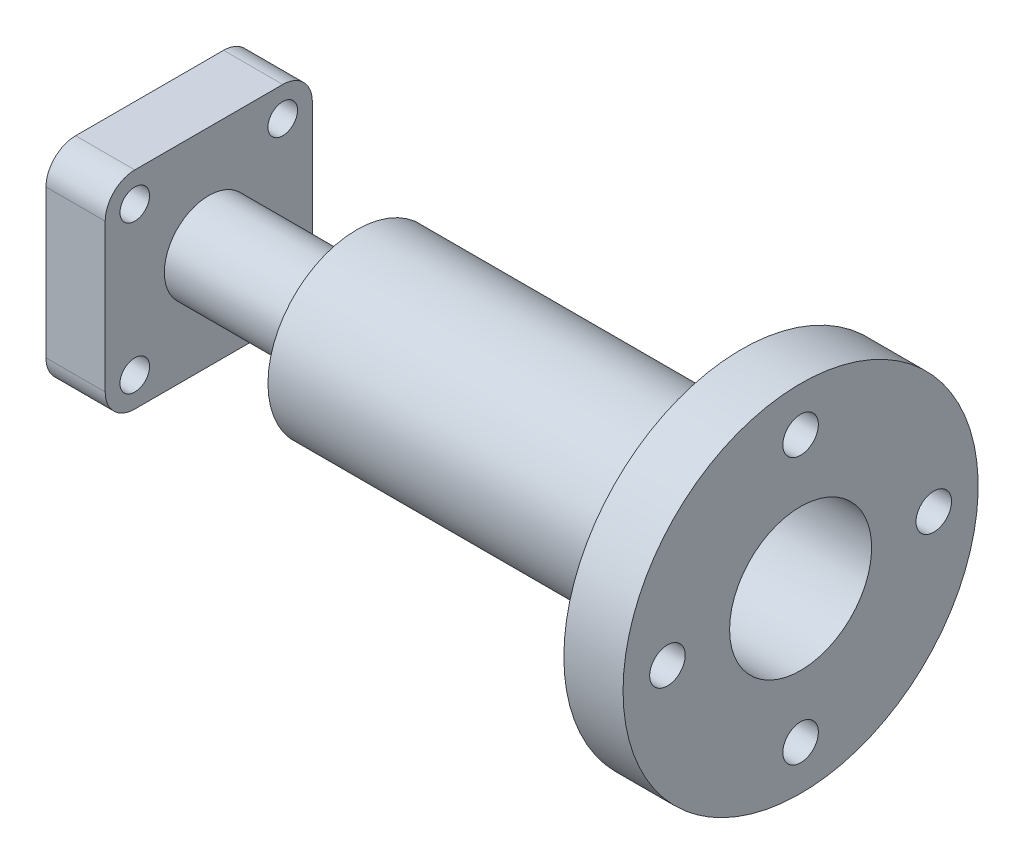
ISO-10303-21;
HEADER;
FILE_DESCRIPTION(('STEP AP214'),'2;1');
FILE_NAME('part.step','',(''),(''),'','','');
FILE_SCHEMA(('AUTOMOTIVE_DESIGN { 1 0 10303 214 1 1 1 1 }'));
ENDSEC;
DATA;
#1=APPLICATION_CONTEXT('core data for automotive mechanical design processes');
#2=APPLICATION_PROTOCOL_DEFINITION('international standard','automotive_design',2000,#1);
#3=PRODUCT_CONTEXT('',#1,'mechanical');
#4=PRODUCT('Part','Part','',(#3));
#5=PRODUCT_RELATED_PRODUCT_CATEGORY('part','',(#4));
#6=PRODUCT_DEFINITION_FORMATION('','',#4);
#7=PRODUCT_DEFINITION_CONTEXT('part definition',#1,'design');
#8=PRODUCT_DEFINITION('design','',#6,#7);
#9=PRODUCT_DEFINITION_SHAPE('','',#8);
#10=(LENGTH_UNIT() NAMED_UNIT(*) SI_UNIT(.MILLI.,.METRE.));
#11=(NAMED_UNIT(*) PLANE_ANGLE_UNIT() SI_UNIT($,.RADIAN.));
#12=(NAMED_UNIT(*) SI_UNIT($,.STERADIAN.) SOLID_ANGLE_UNIT());
#13=UNCERTAINTY_MEASURE_WITH_UNIT(LENGTH_MEASURE(1.E-05),#10,'distance_accuracy_value','');
#14=(GEOMETRIC_REPRESENTATION_CONTEXT(3) GLOBAL_UNCERTAINTY_ASSIGNED_CONTEXT((#13)) GLOBAL_UNIT_ASSIGNED_CONTEXT((#10,
#11,#12)) REPRESENTATION_CONTEXT('',''));
#15=CARTESIAN_POINT('',(0.,0.,0.));
#16=DIRECTION('',(0.,0.,1.));
#17=DIRECTION('',(1.,0.,0.));
#18=AXIS2_PLACEMENT_3D('',#15,#16,#17);
#19=CARTESIAN_POINT('',(180.,60.,0.));
#20=DIRECTION('',(1.,0.,0.));
#21=DIRECTION('',(0.,0.,-1.));
#22=AXIS2_PLACEMENT_3D('',#19,#20,#21);
#23=PLANE('',#22);
#24=CARTESIAN_POINT('',(180.,45.,0.));
#25=DIRECTION('',(1.,0.,0.));
#26=DIRECTION('',(0.,0.,-1.));
#27=AXIS2_PLACEMENT_3D('',#24,#25,#26);
#28=CIRCLE('',#27,5.99999999999999);
#29=CARTESIAN_POINT('',(180.,45.,-5.99999999999999));
#30=VERTEX_POINT('',#29);
#31=EDGE_CURVE('E252',#30,#30,#28,.F.);
#32=ORIENTED_EDGE('',*,*,#31,.F.);
#33=EDGE_LOOP('',(#32));
#34=FACE_BOUND('',#33,.T.);
#35=CARTESIAN_POINT('',(180.,0.,0.));
#36=DIRECTION('',(-1.,0.,0.));
#37=DIRECTION('',(0.,0.,1.));
#38=AXIS2_PLACEMENT_3D('',#35,#36,#37);
#39=CIRCLE('',#38,30.);
#40=CARTESIAN_POINT('',(180.,0.,30.));
#41=VERTEX_POINT('',#40);
#42=EDGE_CURVE('E167',#41,#41,#39,.T.);
#43=ORIENTED_EDGE('',*,*,#42,.F.);
#44=EDGE_LOOP('',(#43));
#45=FACE_BOUND('',#44,.T.);
#46=CARTESIAN_POINT('',(180.,0.,0.));
#47=DIRECTION('',(-1.,0.,0.));
#48=DIRECTION('',(0.,0.,1.));
#49=AXIS2_PLACEMENT_3D('',#46,#47,#48);
#50=CIRCLE('',#49,60.);
#51=CARTESIAN_POINT('',(180.,0.,60.));
#52=VERTEX_POINT('',#51);
#53=EDGE_CURVE('E170',#52,#52,#50,.T.);
#54=ORIENTED_EDGE('',*,*,#53,.T.);
#55=EDGE_LOOP('',(#54));
#56=FACE_BOUND('',#55,.T.);
#57=CARTESIAN_POINT('',(180.,0.,-45.));
#58=DIRECTION('',(1.,0.,0.));
#59=DIRECTION('',(0.,0.,-1.));
#60=AXIS2_PLACEMENT_3D('',#57,#58,#59);
#61=CIRCLE('',#60,5.99999999999999);
#62=CARTESIAN_POINT('',(180.,0.,-51.));
#63=VERTEX_POINT('',#62);
#64=EDGE_CURVE('E236',#63,#63,#61,.F.);
#65=ORIENTED_EDGE('',*,*,#64,.F.);
#66=EDGE_LOOP('',(#65));
#67=FACE_BOUND('',#66,.T.);
#68=CARTESIAN_POINT('',(180.,-45.,0.));
#69=DIRECTION('',(1.,0.,0.));
#70=DIRECTION('',(0.,0.,-1.));
#71=AXIS2_PLACEMENT_3D('',#68,#69,#70);
#72=CIRCLE('',#71,5.99999999999999);
#73=CARTESIAN_POINT('',(180.,-45.,-5.99999999999999));
#74=VERTEX_POINT('',#73);
#75=EDGE_CURVE('E240',#74,#74,#72,.F.);
#76=ORIENTED_EDGE('',*,*,#75,.F.);
#77=EDGE_LOOP('',(#76));
#78=FACE_BOUND('',#77,.T.);
#79=CARTESIAN_POINT('',(180.,0.,45.));
#80=DIRECTION('',(1.,0.,0.));
#81=DIRECTION('',(0.,0.,-1.));
#82=AXIS2_PLACEMENT_3D('',#79,#80,#81);
#83=CIRCLE('',#82,5.99999999999999);
#84=CARTESIAN_POINT('',(180.,0.,39.));
#85=VERTEX_POINT('',#84);
#86=EDGE_CURVE('E246',#85,#85,#83,.F.);
#87=ORIENTED_EDGE('',*,*,#86,.F.);
#88=EDGE_LOOP('',(#87));
#89=FACE_BOUND('',#88,.T.);
#90=ADVANCED_FACE('F44',(#34,#45,#56,#67,#78,#89),#23,.F.);
#91=CARTESIAN_POINT('',(0.,0.,0.));
#92=DIRECTION('',(-1.,0.,0.));
#93=DIRECTION('',(0.,0.,1.));
#94=AXIS2_PLACEMENT_3D('',#91,#92,#93);
#95=CYLINDRICAL_SURFACE('',#94,60.);
#96=ORIENTED_EDGE('',*,*,#53,.F.);
#97=EDGE_LOOP('',(#96));
#98=FACE_BOUND('',#97,.T.);
#99=CARTESIAN_POINT('',(200.,0.,0.));
#100=DIRECTION('',(-1.,0.,0.));
#101=DIRECTION('',(0.,0.,1.));
#102=AXIS2_PLACEMENT_3D('',#99,#100,#101);
#103=CIRCLE('',#102,60.);
#104=CARTESIAN_POINT('',(200.,0.,60.));
#105=VERTEX_POINT('',#104);
#106=EDGE_CURVE('E146',#105,#105,#103,.T.);
#107=ORIENTED_EDGE('',*,*,#106,.T.);
#108=EDGE_LOOP('',(#107));
#109=FACE_BOUND('',#108,.T.);
#110=ADVANCED_FACE('F266',(#98,#109),#95,.T.);
#111=CARTESIAN_POINT('',(0.,0.,0.));
#112=DIRECTION('',(-1.,0.,0.));
#113=DIRECTION('',(0.,0.,1.));
#114=AXIS2_PLACEMENT_3D('',#111,#112,#113);
#115=CYLINDRICAL_SURFACE('',#114,30.);
#116=CARTESIAN_POINT('',(50.,0.,0.));
#117=DIRECTION('',(-1.,0.,0.));
#118=DIRECTION('',(0.,0.,1.));
#119=AXIS2_PLACEMENT_3D('',#116,#117,#118);
#120=CIRCLE('',#119,30.);
#121=CARTESIAN_POINT('',(50.,0.,30.));
#122=VERTEX_POINT('',#121);
#123=EDGE_CURVE('E164',#122,#122,#120,.T.);
#124=ORIENTED_EDGE('',*,*,#123,.F.);
#125=EDGE_LOOP('',(#124));
#126=FACE_BOUND('',#125,.T.);
#127=ORIENTED_EDGE('',*,*,#42,.T.);
#128=EDGE_LOOP('',(#127));
#129=FACE_BOUND('',#128,.T.);
#130=ADVANCED_FACE('F347',(#126,#129),#115,.T.);
#131=CARTESIAN_POINT('',(50.,30.,0.));
#132=DIRECTION('',(1.,0.,0.));
#133=DIRECTION('',(0.,0.,-1.));
#134=AXIS2_PLACEMENT_3D('',#131,#132,#133);
#135=PLANE('',#134);
#136=CARTESIAN_POINT('',(50.,0.,0.));
#137=DIRECTION('',(-1.,0.,0.));
#138=DIRECTION('',(0.,0.,1.));
#139=AXIS2_PLACEMENT_3D('',#136,#137,#138);
#140=CIRCLE('',#139,15.);
#141=CARTESIAN_POINT('',(50.,0.,15.));
#142=VERTEX_POINT('',#141);
#143=EDGE_CURVE('E161',#142,#142,#140,.T.);
#144=ORIENTED_EDGE('',*,*,#143,.F.);
#145=EDGE_LOOP('',(#144));
#146=FACE_BOUND('',#145,.T.);
#147=ORIENTED_EDGE('',*,*,#123,.T.);
#148=EDGE_LOOP('',(#147));
#149=FACE_BOUND('',#148,.T.);
#150=ADVANCED_FACE('F343',(#146,#149),#135,.F.);
#151=CARTESIAN_POINT('',(0.,0.,0.));
#152=DIRECTION('',(-1.,0.,0.));
#153=DIRECTION('',(0.,0.,1.));
#154=AXIS2_PLACEMENT_3D('',#151,#152,#153);
#155=CYLINDRICAL_SURFACE('',#154,15.);
#156=CARTESIAN_POINT('',(0.,0.,0.));
#157=DIRECTION('',(-1.,0.,0.));
#158=DIRECTION('',(0.,0.,1.));
#159=AXIS2_PLACEMENT_3D('',#156,#157,#158);
#160=CIRCLE('',#159,15.);
#161=CARTESIAN_POINT('',(0.,0.,15.));
#162=VERTEX_POINT('',#161);
#163=EDGE_CURVE('E158',#162,#162,#160,.T.);
#164=ORIENTED_EDGE('',*,*,#163,.F.);
#165=EDGE_LOOP('',(#164));
#166=FACE_BOUND('',#165,.T.);
#167=ORIENTED_EDGE('',*,*,#143,.T.);
#168=EDGE_LOOP('',(#167));
#169=FACE_BOUND('',#168,.T.);
#170=ADVANCED_FACE('F314',(#166,#169),#155,.T.);
#171=CARTESIAN_POINT('',(0.,0.,0.));
#172=DIRECTION('',(-1.,0.,0.));
#173=DIRECTION('',(0.,0.,1.));
#174=AXIS2_PLACEMENT_3D('',#171,#172,#173);
#175=CYLINDRICAL_SURFACE('',#174,9.);
#176=CARTESIAN_POINT('',(56.,0.,0.));
#177=DIRECTION('',(-1.,0.,0.));
#178=DIRECTION('',(0.,0.,1.));
#179=AXIS2_PLACEMENT_3D('',#176,#177,#178);
#180=CIRCLE('',#179,9.);
#181=CARTESIAN_POINT('',(56.,0.,9.));
#182=VERTEX_POINT('',#181);
#183=EDGE_CURVE('E155',#182,#182,#180,.T.);
#184=ORIENTED_EDGE('',*,*,#183,.F.);
#185=EDGE_LOOP('',(#184));
#186=FACE_BOUND('',#185,.T.);
#187=CARTESIAN_POINT('',(-20.,0.,0.));
#188=DIRECTION('',(-1.,0.,0.));
#189=DIRECTION('',(0.,0.,1.));
#190=AXIS2_PLACEMENT_3D('',#187,#188,#189);
#191=CIRCLE('',#190,8.99999999999999);
#192=CARTESIAN_POINT('',(-20.,0.,8.99999999999999));
#193=VERTEX_POINT('',#192);
#194=EDGE_CURVE('E231',#193,#193,#191,.T.);
#195=ORIENTED_EDGE('',*,*,#194,.T.);
#196=EDGE_LOOP('',(#195));
#197=FACE_BOUND('',#196,.T.);
#198=ADVANCED_FACE('F308',(#186,#197),#175,.F.);
#199=CARTESIAN_POINT('',(56.,24.,0.));
#200=DIRECTION('',(-1.,0.,0.));
#201=DIRECTION('',(0.,0.,1.));
#202=AXIS2_PLACEMENT_3D('',#199,#200,#201);
#203=PLANE('',#202);
#204=CARTESIAN_POINT('',(56.,0.,0.));
#205=DIRECTION('',(-1.,0.,0.));
#206=DIRECTION('',(0.,0.,1.));
#207=AXIS2_PLACEMENT_3D('',#204,#205,#206);
#208=CIRCLE('',#207,24.);
#209=CARTESIAN_POINT('',(56.,0.,24.));
#210=VERTEX_POINT('',#209);
#211=EDGE_CURVE('E152',#210,#210,#208,.T.);
#212=ORIENTED_EDGE('',*,*,#211,.F.);
#213=EDGE_LOOP('',(#212));
#214=FACE_BOUND('',#213,.T.);
#215=ORIENTED_EDGE('',*,*,#183,.T.);
#216=EDGE_LOOP('',(#215));
#217=FACE_BOUND('',#216,.T.);
#218=ADVANCED_FACE('F302',(#214,#217),#203,.F.);
#219=CARTESIAN_POINT('',(0.,0.,0.));
#220=DIRECTION('',(-1.,0.,0.));
#221=DIRECTION('',(0.,0.,1.));
#222=AXIS2_PLACEMENT_3D('',#219,#220,#221);
#223=CYLINDRICAL_SURFACE('',#222,24.);
#224=CARTESIAN_POINT('',(200.,0.,0.));
#225=DIRECTION('',(-1.,0.,0.));
#226=DIRECTION('',(0.,0.,1.));
#227=AXIS2_PLACEMENT_3D('',#224,#225,#226);
#228=CIRCLE('',#227,24.);
#229=CARTESIAN_POINT('',(200.,0.,24.));
#230=VERTEX_POINT('',#229);
#231=EDGE_CURVE('E149',#230,#230,#228,.T.);
#232=ORIENTED_EDGE('',*,*,#231,.F.);
#233=EDGE_LOOP('',(#232));
#234=FACE_BOUND('',#233,.T.);
#235=ORIENTED_EDGE('',*,*,#211,.T.);
#236=EDGE_LOOP('',(#235));
#237=FACE_BOUND('',#236,.T.);
#238=ADVANCED_FACE('F289',(#234,#237),#223,.F.);
#239=CARTESIAN_POINT('',(200.,24.,0.));
#240=DIRECTION('',(-1.,0.,0.));
#241=DIRECTION('',(0.,0.,1.));
#242=AXIS2_PLACEMENT_3D('',#239,#240,#241);
#243=PLANE('',#242);
#244=CARTESIAN_POINT('',(200.,45.,0.));
#245=DIRECTION('',(1.,0.,0.));
#246=DIRECTION('',(0.,0.,-1.));
#247=AXIS2_PLACEMENT_3D('',#244,#245,#246);
#248=CIRCLE('',#247,5.99999999999998);
#249=CARTESIAN_POINT('',(200.,45.,-5.99999999999998));
#250=VERTEX_POINT('',#249);
#251=EDGE_CURVE('E255',#250,#250,#248,.T.);
#252=ORIENTED_EDGE('',*,*,#251,.F.);
#253=EDGE_LOOP('',(#252));
#254=FACE_BOUND('',#253,.T.);
#255=CARTESIAN_POINT('',(200.,0.,45.));
#256=DIRECTION('',(1.,0.,0.));
#257=DIRECTION('',(0.,0.,-1.));
#258=AXIS2_PLACEMENT_3D('',#255,#256,#257);
#259=CIRCLE('',#258,5.99999999999999);
#260=CARTESIAN_POINT('',(200.,0.,39.));
#261=VERTEX_POINT('',#260);
#262=EDGE_CURVE('E249',#261,#261,#259,.T.);
#263=ORIENTED_EDGE('',*,*,#262,.F.);
#264=EDGE_LOOP('',(#263));
#265=FACE_BOUND('',#264,.T.);
#266=CARTESIAN_POINT('',(200.,-45.,0.));
#267=DIRECTION('',(1.,0.,0.));
#268=DIRECTION('',(0.,0.,-1.));
#269=AXIS2_PLACEMENT_3D('',#266,#267,#268);
#270=CIRCLE('',#269,5.99999999999998);
#271=CARTESIAN_POINT('',(200.,-45.,-5.99999999999998));
#272=VERTEX_POINT('',#271);
#273=EDGE_CURVE('E243',#272,#272,#270,.T.);
#274=ORIENTED_EDGE('',*,*,#273,.F.);
#275=EDGE_LOOP('',(#274));
#276=FACE_BOUND('',#275,.T.);
#277=CARTESIAN_POINT('',(200.,0.,-45.));
#278=DIRECTION('',(1.,0.,0.));
#279=DIRECTION('',(0.,0.,-1.));
#280=AXIS2_PLACEMENT_3D('',#277,#278,#279);
#281=CIRCLE('',#280,5.99999999999999);
#282=CARTESIAN_POINT('',(200.,0.,-51.));
#283=VERTEX_POINT('',#282);
#284=EDGE_CURVE('E237',#283,#283,#281,.T.);
#285=ORIENTED_EDGE('',*,*,#284,.F.);
#286=EDGE_LOOP('',(#285));
#287=FACE_BOUND('',#286,.T.);
#288=ORIENTED_EDGE('',*,*,#106,.F.);
#289=EDGE_LOOP('',(#288));
#290=FACE_BOUND('',#289,.T.);
#291=ORIENTED_EDGE('',*,*,#231,.T.);
#292=EDGE_LOOP('',(#291));
#293=FACE_BOUND('',#292,.T.);
#294=ADVANCED_FACE('F285',(#254,#265,#276,#287,#290,#293),#243,.F.);
#295=CARTESIAN_POINT('',(-20.,0.,0.));
#296=DIRECTION('',(1.,0.,0.));
#297=DIRECTION('',(0.,0.,-1.));
#298=AXIS2_PLACEMENT_3D('',#295,#296,#297);
#299=PLANE('',#298);
#300=DIRECTION('',(0.,-1.,0.));
#301=VECTOR('',#300,1.);
#302=CARTESIAN_POINT('',(-20.,-35.,-35.));
#303=LINE('',#302,#301);
#304=CARTESIAN_POINT('',(-20.,25.,-35.));
#305=VERTEX_POINT('',#304);
#306=CARTESIAN_POINT('',(-20.,-25.,-35.));
#307=VERTEX_POINT('',#306);
#308=EDGE_CURVE('E209',#305,#307,#303,.T.);
#309=ORIENTED_EDGE('',*,*,#308,.T.);
#310=CARTESIAN_POINT('',(-20.,-25.,-25.));
#311=DIRECTION('',(1.,0.,0.));
#312=DIRECTION('',(0.,0.,-1.));
#313=AXIS2_PLACEMENT_3D('',#310,#311,#312);
#314=CIRCLE('',#313,10.);
#315=CARTESIAN_POINT('',(-20.,-35.,-25.));
#316=VERTEX_POINT('',#315);
#317=EDGE_CURVE('E186',#307,#316,#314,.F.);
#318=ORIENTED_EDGE('',*,*,#317,.T.);
#319=DIRECTION('',(0.,0.,1.));
#320=VECTOR('',#319,1.);
#321=CARTESIAN_POINT('',(-20.,-35.,-35.));
#322=LINE('',#321,#320);
#323=CARTESIAN_POINT('',(-20.,-35.,25.));
#324=VERTEX_POINT('',#323);
#325=EDGE_CURVE('E130',#316,#324,#322,.T.);
#326=ORIENTED_EDGE('',*,*,#325,.T.);
#327=CARTESIAN_POINT('',(-20.,-25.,25.));
#328=DIRECTION('',(1.,0.,0.));
#329=DIRECTION('',(0.,0.,-1.));
#330=AXIS2_PLACEMENT_3D('',#327,#328,#329);
#331=CIRCLE('',#330,10.);
#332=CARTESIAN_POINT('',(-20.,-25.,35.));
#333=VERTEX_POINT('',#332);
#334=EDGE_CURVE('E184',#324,#333,#331,.F.);
#335=ORIENTED_EDGE('',*,*,#334,.T.);
#336=DIRECTION('',(0.,1.,0.));
#337=VECTOR('',#336,1.);
#338=CARTESIAN_POINT('',(-20.,-35.,35.));
#339=LINE('',#338,#337);
#340=CARTESIAN_POINT('',(-20.,25.,35.));
#341=VERTEX_POINT('',#340);
#342=EDGE_CURVE('E137',#333,#341,#339,.T.);
#343=ORIENTED_EDGE('',*,*,#342,.T.);
#344=CARTESIAN_POINT('',(-20.,25.,25.));
#345=DIRECTION('',(1.,0.,0.));
#346=DIRECTION('',(0.,0.,-1.));
#347=AXIS2_PLACEMENT_3D('',#344,#345,#346);
#348=CIRCLE('',#347,10.);
#349=CARTESIAN_POINT('',(-20.,35.,25.));
#350=VERTEX_POINT('',#349);
#351=EDGE_CURVE('E65',#341,#350,#348,.F.);
#352=ORIENTED_EDGE('',*,*,#351,.T.);
#353=DIRECTION('',(0.,0.,-1.));
#354=VECTOR('',#353,1.);
#355=CARTESIAN_POINT('',(-20.,35.,-35.));
#356=LINE('',#355,#354);
#357=CARTESIAN_POINT('',(-20.,35.,-25.));
#358=VERTEX_POINT('',#357);
#359=EDGE_CURVE('E140',#350,#358,#356,.T.);
#360=ORIENTED_EDGE('',*,*,#359,.T.);
#361=CARTESIAN_POINT('',(-20.,25.,-25.));
#362=DIRECTION('',(1.,0.,0.));
#363=DIRECTION('',(0.,0.,-1.));
#364=AXIS2_PLACEMENT_3D('',#361,#362,#363);
#365=CIRCLE('',#364,10.);
#366=EDGE_CURVE('E181',#358,#305,#365,.F.);
#367=ORIENTED_EDGE('',*,*,#366,.T.);
#368=EDGE_LOOP('',(#309,#318,#326,#335,#343,#352,#360,#367));
#369=FACE_BOUND('',#368,.T.);
#370=CARTESIAN_POINT('',(-20.,25.,-25.));
#371=DIRECTION('',(-1.,0.,0.));
#372=DIRECTION('',(0.,0.,1.));
#373=AXIS2_PLACEMENT_3D('',#370,#371,#372);
#374=CIRCLE('',#373,5.);
#375=CARTESIAN_POINT('',(-20.,25.,-20.));
#376=VERTEX_POINT('',#375);
#377=EDGE_CURVE('E202',#376,#376,#374,.T.);
#378=ORIENTED_EDGE('',*,*,#377,.F.);
#379=EDGE_LOOP('',(#378));
#380=FACE_BOUND('',#379,.T.);
#381=CARTESIAN_POINT('',(-20.,25.,25.));
#382=DIRECTION('',(-1.,0.,0.));
#383=DIRECTION('',(0.,0.,1.));
#384=AXIS2_PLACEMENT_3D('',#381,#382,#383);
#385=CIRCLE('',#384,5.);
#386=CARTESIAN_POINT('',(-20.,25.,30.));
#387=VERTEX_POINT('',#386);
#388=EDGE_CURVE('E214',#387,#387,#385,.T.);
#389=ORIENTED_EDGE('',*,*,#388,.F.);
#390=EDGE_LOOP('',(#389));
#391=FACE_BOUND('',#390,.T.);
#392=CARTESIAN_POINT('',(-20.,-25.,25.));
#393=DIRECTION('',(-1.,0.,0.));
#394=DIRECTION('',(0.,0.,-1.));
#395=AXIS2_PLACEMENT_3D('',#392,#393,#394);
#396=CIRCLE('',#395,5.);
#397=CARTESIAN_POINT('',(-20.,-25.,20.));
#398=VERTEX_POINT('',#397);
#399=EDGE_CURVE('E219',#398,#398,#396,.T.);
#400=ORIENTED_EDGE('',*,*,#399,.F.);
#401=EDGE_LOOP('',(#400));
#402=FACE_BOUND('',#401,.T.);
#403=CARTESIAN_POINT('',(-20.,-25.,-25.));
#404=DIRECTION('',(-1.,0.,0.));
#405=DIRECTION('',(0.,0.,-1.));
#406=AXIS2_PLACEMENT_3D('',#403,#404,#405);
#407=CIRCLE('',#406,5.00000000000001);
#408=CARTESIAN_POINT('',(-20.,-25.,-30.));
#409=VERTEX_POINT('',#408);
#410=EDGE_CURVE('E225',#409,#409,#407,.T.);
#411=ORIENTED_EDGE('',*,*,#410,.F.);
#412=EDGE_LOOP('',(#411));
#413=FACE_BOUND('',#412,.T.);
#414=ORIENTED_EDGE('',*,*,#194,.F.);
#415=EDGE_LOOP('',(#414));
#416=FACE_BOUND('',#415,.T.);
#417=ADVANCED_FACE('F288',(#369,#380,#391,#402,#413,#416),#299,.F.);
#418=CARTESIAN_POINT('',(0.,0.,0.));
#419=DIRECTION('',(1.,0.,0.));
#420=DIRECTION('',(0.,0.,-1.));
#421=AXIS2_PLACEMENT_3D('',#418,#419,#420);
#422=PLANE('',#421);
#423=ORIENTED_EDGE('',*,*,#163,.T.);
#424=EDGE_LOOP('',(#423));
#425=FACE_BOUND('',#424,.T.);
#426=CARTESIAN_POINT('',(0.,-25.,-25.));
#427=DIRECTION('',(-1.,0.,0.));
#428=DIRECTION('',(0.,0.,-1.));
#429=AXIS2_PLACEMENT_3D('',#426,#427,#428);
#430=CIRCLE('',#429,5.00000000000001);
#431=CARTESIAN_POINT('',(0.,-25.,-30.));
#432=VERTEX_POINT('',#431);
#433=EDGE_CURVE('E228',#432,#432,#430,.T.);
#434=ORIENTED_EDGE('',*,*,#433,.T.);
#435=EDGE_LOOP('',(#434));
#436=FACE_BOUND('',#435,.T.);
#437=CARTESIAN_POINT('',(0.,25.,25.));
#438=DIRECTION('',(-1.,0.,0.));
#439=DIRECTION('',(0.,0.,1.));
#440=AXIS2_PLACEMENT_3D('',#437,#438,#439);
#441=CIRCLE('',#440,5.);
#442=CARTESIAN_POINT('',(0.,25.,30.));
#443=VERTEX_POINT('',#442);
#444=EDGE_CURVE('E216',#443,#443,#441,.T.);
#445=ORIENTED_EDGE('',*,*,#444,.T.);
#446=EDGE_LOOP('',(#445));
#447=FACE_BOUND('',#446,.T.);
#448=DIRECTION('',(0.,0.,1.));
#449=VECTOR('',#448,1.);
#450=CARTESIAN_POINT('',(0.,-35.,-35.));
#451=LINE('',#450,#449);
#452=CARTESIAN_POINT('',(0.,-35.,-25.));
#453=VERTEX_POINT('',#452);
#454=CARTESIAN_POINT('',(0.,-35.,25.));
#455=VERTEX_POINT('',#454);
#456=EDGE_CURVE('E127',#453,#455,#451,.T.);
#457=ORIENTED_EDGE('',*,*,#456,.F.);
#458=CARTESIAN_POINT('',(0.,-25.,-25.));
#459=DIRECTION('',(1.,0.,0.));
#460=DIRECTION('',(0.,0.,-1.));
#461=AXIS2_PLACEMENT_3D('',#458,#459,#460);
#462=CIRCLE('',#461,10.);
#463=CARTESIAN_POINT('',(0.,-25.,-35.));
#464=VERTEX_POINT('',#463);
#465=EDGE_CURVE('E110',#453,#464,#462,.T.);
#466=ORIENTED_EDGE('',*,*,#465,.T.);
#467=DIRECTION('',(0.,-1.,0.));
#468=VECTOR('',#467,1.);
#469=CARTESIAN_POINT('',(0.,-35.,-35.));
#470=LINE('',#469,#468);
#471=CARTESIAN_POINT('',(0.,25.,-35.));
#472=VERTEX_POINT('',#471);
#473=EDGE_CURVE('E138',#472,#464,#470,.T.);
#474=ORIENTED_EDGE('',*,*,#473,.F.);
#475=CARTESIAN_POINT('',(0.,25.,-25.));
#476=DIRECTION('',(1.,0.,0.));
#477=DIRECTION('',(0.,0.,-1.));
#478=AXIS2_PLACEMENT_3D('',#475,#476,#477);
#479=CIRCLE('',#478,10.);
#480=CARTESIAN_POINT('',(0.,35.,-25.));
#481=VERTEX_POINT('',#480);
#482=EDGE_CURVE('E131',#472,#481,#479,.T.);
#483=ORIENTED_EDGE('',*,*,#482,.T.);
#484=DIRECTION('',(0.,0.,-1.));
#485=VECTOR('',#484,1.);
#486=CARTESIAN_POINT('',(0.,35.,-35.));
#487=LINE('',#486,#485);
#488=CARTESIAN_POINT('',(0.,35.,25.));
#489=VERTEX_POINT('',#488);
#490=EDGE_CURVE('E142',#489,#481,#487,.T.);
#491=ORIENTED_EDGE('',*,*,#490,.F.);
#492=CARTESIAN_POINT('',(0.,25.,25.));
#493=DIRECTION('',(1.,0.,0.));
#494=DIRECTION('',(0.,0.,-1.));
#495=AXIS2_PLACEMENT_3D('',#492,#493,#494);
#496=CIRCLE('',#495,10.);
#497=CARTESIAN_POINT('',(0.,25.,35.));
#498=VERTEX_POINT('',#497);
#499=EDGE_CURVE('E175',#489,#498,#496,.T.);
#500=ORIENTED_EDGE('',*,*,#499,.T.);
#501=DIRECTION('',(0.,1.,0.));
#502=VECTOR('',#501,1.);
#503=CARTESIAN_POINT('',(0.,-35.,35.));
#504=LINE('',#503,#502);
#505=CARTESIAN_POINT('',(0.,-25.,35.));
#506=VERTEX_POINT('',#505);
#507=EDGE_CURVE('E197',#506,#498,#504,.T.);
#508=ORIENTED_EDGE('',*,*,#507,.F.);
#509=CARTESIAN_POINT('',(0.,-25.,25.));
#510=DIRECTION('',(1.,0.,0.));
#511=DIRECTION('',(0.,0.,-1.));
#512=AXIS2_PLACEMENT_3D('',#509,#510,#511);
#513=CIRCLE('',#512,10.);
#514=EDGE_CURVE('E121',#506,#455,#513,.T.);
#515=ORIENTED_EDGE('',*,*,#514,.T.);
#516=EDGE_LOOP('',(#457,#466,#474,#483,#491,#500,#508,#515));
#517=FACE_BOUND('',#516,.T.);
#518=CARTESIAN_POINT('',(0.,25.,-25.));
#519=DIRECTION('',(-1.,0.,0.));
#520=DIRECTION('',(0.,0.,1.));
#521=AXIS2_PLACEMENT_3D('',#518,#519,#520);
#522=CIRCLE('',#521,5.);
#523=CARTESIAN_POINT('',(0.,25.,-20.));
#524=VERTEX_POINT('',#523);
#525=EDGE_CURVE('E205',#524,#524,#522,.T.);
#526=ORIENTED_EDGE('',*,*,#525,.T.);
#527=EDGE_LOOP('',(#526));
#528=FACE_BOUND('',#527,.T.);
#529=CARTESIAN_POINT('',(0.,-25.,25.));
#530=DIRECTION('',(-1.,0.,0.));
#531=DIRECTION('',(0.,0.,-1.));
#532=AXIS2_PLACEMENT_3D('',#529,#530,#531);
#533=CIRCLE('',#532,5.);
#534=CARTESIAN_POINT('',(0.,-25.,20.));
#535=VERTEX_POINT('',#534);
#536=EDGE_CURVE('E222',#535,#535,#533,.T.);
#537=ORIENTED_EDGE('',*,*,#536,.T.);
#538=EDGE_LOOP('',(#537));
#539=FACE_BOUND('',#538,.T.);
#540=ADVANCED_FACE('F134',(#425,#436,#447,#517,#528,#539),#422,.T.);
#541=CARTESIAN_POINT('',(-20.,-35.,35.));
#542=DIRECTION('',(0.,0.,-1.));
#543=DIRECTION('',(-1.,0.,0.));
#544=AXIS2_PLACEMENT_3D('',#541,#542,#543);
#545=PLANE('',#544);
#546=ORIENTED_EDGE('',*,*,#342,.F.);
#547=DIRECTION('',(1.,0.,0.));
#548=VECTOR('',#547,1.);
#549=CARTESIAN_POINT('',(-20.,-25.,35.));
#550=LINE('',#549,#548);
#551=EDGE_CURVE('E190',#333,#506,#550,.T.);
#552=ORIENTED_EDGE('',*,*,#551,.T.);
#553=ORIENTED_EDGE('',*,*,#507,.T.);
#554=DIRECTION('',(1.,0.,0.));
#555=VECTOR('',#554,1.);
#556=CARTESIAN_POINT('',(-20.,25.,35.));
#557=LINE('',#556,#555);
#558=EDGE_CURVE('E188',#498,#341,#557,.F.);
#559=ORIENTED_EDGE('',*,*,#558,.T.);
#560=EDGE_LOOP('',(#546,#552,#553,#559));
#561=FACE_BOUND('',#560,.T.);
#562=ADVANCED_FACE('F196',(#561),#545,.F.);
#563=CARTESIAN_POINT('',(-20.,35.,-35.));
#564=DIRECTION('',(0.,-1.,0.));
#565=DIRECTION('',(0.,0.,-1.));
#566=AXIS2_PLACEMENT_3D('',#563,#564,#565);
#567=PLANE('',#566);
#568=ORIENTED_EDGE('',*,*,#359,.F.);
#569=DIRECTION('',(1.,0.,0.));
#570=VECTOR('',#569,1.);
#571=CARTESIAN_POINT('',(-20.,35.,25.));
#572=LINE('',#571,#570);
#573=EDGE_CURVE('E13',#350,#489,#572,.T.);
#574=ORIENTED_EDGE('',*,*,#573,.T.);
#575=ORIENTED_EDGE('',*,*,#490,.T.);
#576=DIRECTION('',(1.,0.,0.));
#577=VECTOR('',#576,1.);
#578=CARTESIAN_POINT('',(-20.,35.,-25.));
#579=LINE('',#578,#577);
#580=EDGE_CURVE('E52',#481,#358,#579,.F.);
#581=ORIENTED_EDGE('',*,*,#580,.T.);
#582=EDGE_LOOP('',(#568,#574,#575,#581));
#583=FACE_BOUND('',#582,.T.);
#584=ADVANCED_FACE('F335',(#583),#567,.F.);
#585=CARTESIAN_POINT('',(-20.,-35.,-35.));
#586=DIRECTION('',(0.,0.,1.));
#587=DIRECTION('',(1.,0.,0.));
#588=AXIS2_PLACEMENT_3D('',#585,#586,#587);
#589=PLANE('',#588);
#590=ORIENTED_EDGE('',*,*,#473,.T.);
#591=DIRECTION('',(1.,0.,0.));
#592=VECTOR('',#591,1.);
#593=CARTESIAN_POINT('',(-20.,-25.,-35.));
#594=LINE('',#593,#592);
#595=EDGE_CURVE('E115',#464,#307,#594,.F.);
#596=ORIENTED_EDGE('',*,*,#595,.T.);
#597=ORIENTED_EDGE('',*,*,#308,.F.);
#598=DIRECTION('',(1.,0.,0.));
#599=VECTOR('',#598,1.);
#600=CARTESIAN_POINT('',(-20.,25.,-35.));
#601=LINE('',#600,#599);
#602=EDGE_CURVE('E120',#305,#472,#601,.T.);
#603=ORIENTED_EDGE('',*,*,#602,.T.);
#604=EDGE_LOOP('',(#590,#596,#597,#603));
#605=FACE_BOUND('',#604,.T.);
#606=ADVANCED_FACE('F332',(#605),#589,.F.);
#607=CARTESIAN_POINT('',(-20.,-35.,-35.));
#608=DIRECTION('',(0.,1.,0.));
#609=DIRECTION('',(0.,0.,1.));
#610=AXIS2_PLACEMENT_3D('',#607,#608,#609);
#611=PLANE('',#610);
#612=ORIENTED_EDGE('',*,*,#325,.F.);
#613=DIRECTION('',(1.,0.,0.));
#614=VECTOR('',#613,1.);
#615=CARTESIAN_POINT('',(-20.,-35.,-25.));
#616=LINE('',#615,#614);
#617=EDGE_CURVE('E114',#316,#453,#616,.T.);
#618=ORIENTED_EDGE('',*,*,#617,.T.);
#619=ORIENTED_EDGE('',*,*,#456,.T.);
#620=DIRECTION('',(1.,0.,0.));
#621=VECTOR('',#620,1.);
#622=CARTESIAN_POINT('',(-20.,-35.,25.));
#623=LINE('',#622,#621);
#624=EDGE_CURVE('E132',#455,#324,#623,.F.);
#625=ORIENTED_EDGE('',*,*,#624,.T.);
#626=EDGE_LOOP('',(#612,#618,#619,#625));
#627=FACE_BOUND('',#626,.T.);
#628=ADVANCED_FACE('F126',(#627),#611,.F.);
#629=CARTESIAN_POINT('',(-20.,25.,-25.));
#630=DIRECTION('',(1.,0.,0.));
#631=DIRECTION('',(0.,0.,-1.));
#632=AXIS2_PLACEMENT_3D('',#629,#630,#631);
#633=CYLINDRICAL_SURFACE('',#632,5.);
#634=ORIENTED_EDGE('',*,*,#377,.T.);
#635=EDGE_LOOP('',(#634));
#636=FACE_BOUND('',#635,.T.);
#637=ORIENTED_EDGE('',*,*,#525,.F.);
#638=EDGE_LOOP('',(#637));
#639=FACE_BOUND('',#638,.T.);
#640=ADVANCED_FACE('F327',(#636,#639),#633,.F.);
#641=CARTESIAN_POINT('',(-20.,25.,25.));
#642=DIRECTION('',(1.,0.,0.));
#643=DIRECTION('',(0.,0.,-1.));
#644=AXIS2_PLACEMENT_3D('',#641,#642,#643);
#645=CYLINDRICAL_SURFACE('',#644,5.);
#646=ORIENTED_EDGE('',*,*,#388,.T.);
#647=EDGE_LOOP('',(#646));
#648=FACE_BOUND('',#647,.T.);
#649=ORIENTED_EDGE('',*,*,#444,.F.);
#650=EDGE_LOOP('',(#649));
#651=FACE_BOUND('',#650,.T.);
#652=ADVANCED_FACE('F389',(#648,#651),#645,.F.);
#653=CARTESIAN_POINT('',(-20.,-25.,25.));
#654=DIRECTION('',(1.,0.,0.));
#655=DIRECTION('',(0.,0.,-1.));
#656=AXIS2_PLACEMENT_3D('',#653,#654,#655);
#657=CYLINDRICAL_SURFACE('',#656,5.);
#658=ORIENTED_EDGE('',*,*,#399,.T.);
#659=EDGE_LOOP('',(#658));
#660=FACE_BOUND('',#659,.T.);
#661=ORIENTED_EDGE('',*,*,#536,.F.);
#662=EDGE_LOOP('',(#661));
#663=FACE_BOUND('',#662,.T.);
#664=ADVANCED_FACE('F386',(#660,#663),#657,.F.);
#665=CARTESIAN_POINT('',(-20.,-25.,-25.));
#666=DIRECTION('',(1.,0.,0.));
#667=DIRECTION('',(0.,0.,-1.));
#668=AXIS2_PLACEMENT_3D('',#665,#666,#667);
#669=CYLINDRICAL_SURFACE('',#668,5.00000000000001);
#670=ORIENTED_EDGE('',*,*,#410,.T.);
#671=EDGE_LOOP('',(#670));
#672=FACE_BOUND('',#671,.T.);
#673=ORIENTED_EDGE('',*,*,#433,.F.);
#674=EDGE_LOOP('',(#673));
#675=FACE_BOUND('',#674,.T.);
#676=ADVANCED_FACE('F358',(#672,#675),#669,.F.);
#677=CARTESIAN_POINT('',(-20.,-25.,-25.));
#678=DIRECTION('',(1.,0.,0.));
#679=DIRECTION('',(0.,0.,-1.));
#680=AXIS2_PLACEMENT_3D('',#677,#678,#679);
#681=CYLINDRICAL_SURFACE('',#680,10.);
#682=ORIENTED_EDGE('',*,*,#317,.F.);
#683=ORIENTED_EDGE('',*,*,#595,.F.);
#684=ORIENTED_EDGE('',*,*,#465,.F.);
#685=ORIENTED_EDGE('',*,*,#617,.F.);
#686=EDGE_LOOP('',(#682,#683,#684,#685));
#687=FACE_BOUND('',#686,.T.);
#688=ADVANCED_FACE('F113',(#687),#681,.T.);
#689=CARTESIAN_POINT('',(-20.,-25.,25.));
#690=DIRECTION('',(1.,0.,0.));
#691=DIRECTION('',(0.,0.,-1.));
#692=AXIS2_PLACEMENT_3D('',#689,#690,#691);
#693=CYLINDRICAL_SURFACE('',#692,10.);
#694=ORIENTED_EDGE('',*,*,#334,.F.);
#695=ORIENTED_EDGE('',*,*,#624,.F.);
#696=ORIENTED_EDGE('',*,*,#514,.F.);
#697=ORIENTED_EDGE('',*,*,#551,.F.);
#698=EDGE_LOOP('',(#694,#695,#696,#697));
#699=FACE_BOUND('',#698,.T.);
#700=ADVANCED_FACE('F357',(#699),#693,.T.);
#701=CARTESIAN_POINT('',(-20.,25.,25.));
#702=DIRECTION('',(1.,0.,0.));
#703=DIRECTION('',(0.,0.,-1.));
#704=AXIS2_PLACEMENT_3D('',#701,#702,#703);
#705=CYLINDRICAL_SURFACE('',#704,10.);
#706=ORIENTED_EDGE('',*,*,#351,.F.);
#707=ORIENTED_EDGE('',*,*,#558,.F.);
#708=ORIENTED_EDGE('',*,*,#499,.F.);
#709=ORIENTED_EDGE('',*,*,#573,.F.);
#710=EDGE_LOOP('',(#706,#707,#708,#709));
#711=FACE_BOUND('',#710,.T.);
#712=ADVANCED_FACE('F360',(#711),#705,.T.);
#713=CARTESIAN_POINT('',(-20.,25.,-25.));
#714=DIRECTION('',(1.,0.,0.));
#715=DIRECTION('',(0.,0.,-1.));
#716=AXIS2_PLACEMENT_3D('',#713,#714,#715);
#717=CYLINDRICAL_SURFACE('',#716,10.);
#718=ORIENTED_EDGE('',*,*,#366,.F.);
#719=ORIENTED_EDGE('',*,*,#580,.F.);
#720=ORIENTED_EDGE('',*,*,#482,.F.);
#721=ORIENTED_EDGE('',*,*,#602,.F.);
#722=EDGE_LOOP('',(#718,#719,#720,#721));
#723=FACE_BOUND('',#722,.T.);
#724=ADVANCED_FACE('F46',(#723),#717,.T.);
#725=CARTESIAN_POINT('',(200.,0.,-45.));
#726=DIRECTION('',(1.,0.,0.));
#727=DIRECTION('',(0.,0.,-1.));
#728=AXIS2_PLACEMENT_3D('',#725,#726,#727);
#729=CYLINDRICAL_SURFACE('',#728,5.99999999999999);
#730=ORIENTED_EDGE('',*,*,#64,.T.);
#731=EDGE_LOOP('',(#730));
#732=FACE_BOUND('',#731,.T.);
#733=ORIENTED_EDGE('',*,*,#284,.T.);
#734=EDGE_LOOP('',(#733));
#735=FACE_BOUND('',#734,.T.);
#736=ADVANCED_FACE('F366',(#732,#735),#729,.F.);
#737=CARTESIAN_POINT('',(200.,-45.,0.));
#738=DIRECTION('',(1.,0.,0.));
#739=DIRECTION('',(0.,0.,-1.));
#740=AXIS2_PLACEMENT_3D('',#737,#738,#739);
#741=CYLINDRICAL_SURFACE('',#740,5.99999999999999);
#742=ORIENTED_EDGE('',*,*,#75,.T.);
#743=EDGE_LOOP('',(#742));
#744=FACE_BOUND('',#743,.T.);
#745=ORIENTED_EDGE('',*,*,#273,.T.);
#746=EDGE_LOOP('',(#745));
#747=FACE_BOUND('',#746,.T.);
#748=ADVANCED_FACE('F281',(#744,#747),#741,.F.);
#749=CARTESIAN_POINT('',(200.,0.,45.));
#750=DIRECTION('',(1.,0.,0.));
#751=DIRECTION('',(0.,0.,-1.));
#752=AXIS2_PLACEMENT_3D('',#749,#750,#751);
#753=CYLINDRICAL_SURFACE('',#752,5.99999999999999);
#754=ORIENTED_EDGE('',*,*,#86,.T.);
#755=EDGE_LOOP('',(#754));
#756=FACE_BOUND('',#755,.T.);
#757=ORIENTED_EDGE('',*,*,#262,.T.);
#758=EDGE_LOOP('',(#757));
#759=FACE_BOUND('',#758,.T.);
#760=ADVANCED_FACE('F278',(#756,#759),#753,.F.);
#761=CARTESIAN_POINT('',(200.,45.,0.));
#762=DIRECTION('',(1.,0.,0.));
#763=DIRECTION('',(0.,0.,-1.));
#764=AXIS2_PLACEMENT_3D('',#761,#762,#763);
#765=CYLINDRICAL_SURFACE('',#764,5.99999999999999);
#766=ORIENTED_EDGE('',*,*,#31,.T.);
#767=EDGE_LOOP('',(#766));
#768=FACE_BOUND('',#767,.T.);
#769=ORIENTED_EDGE('',*,*,#251,.T.);
#770=EDGE_LOOP('',(#769));
#771=FACE_BOUND('',#770,.T.);
#772=ADVANCED_FACE('F261',(#768,#771),#765,.F.);
#773=CLOSED_SHELL('',(#90,#110,#130,#150,#170,#198,#218,#238,#294,#417,#540,#562,#584,#606,#628,
#640,#652,#664,#676,#688,#700,#712,#724,#736,#748,#760,#772));
#774=MANIFOLD_SOLID_BREP('B2',#773);
#775=ADVANCED_BREP_SHAPE_REPRESENTATION('',(#18,#774),#14);
#776=SHAPE_DEFINITION_REPRESENTATION(#9,#775);
ENDSEC;
END-ISO-10303-21;
